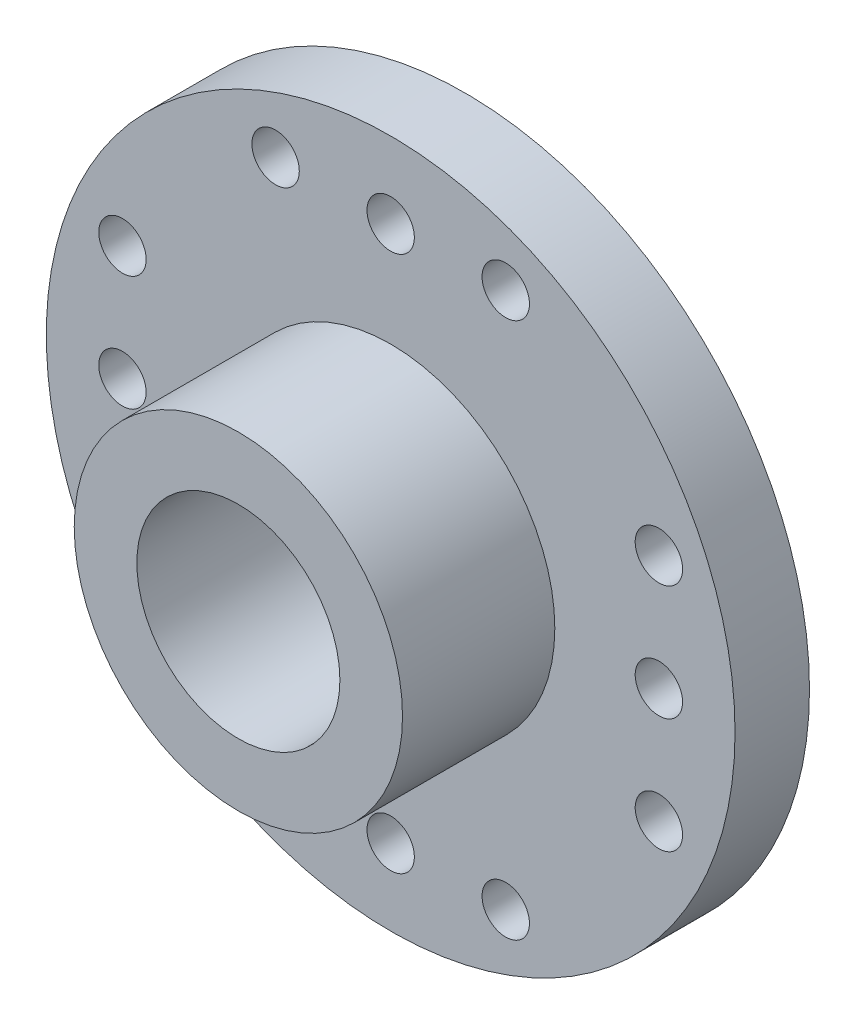
ISO-10303-21;
HEADER;
FILE_DESCRIPTION(('STEP AP214'),'2;1');
FILE_NAME('part.step','',(''),(''),'','','');
FILE_SCHEMA(('AUTOMOTIVE_DESIGN { 1 0 10303 214 1 1 1 1 }'));
ENDSEC;
DATA;
#1=APPLICATION_CONTEXT('core data for automotive mechanical design processes');
#2=APPLICATION_PROTOCOL_DEFINITION('international standard','automotive_design',2000,#1);
#3=PRODUCT_CONTEXT('',#1,'mechanical');
#4=PRODUCT('Part','Part','',(#3));
#5=PRODUCT_RELATED_PRODUCT_CATEGORY('part','',(#4));
#6=PRODUCT_DEFINITION_FORMATION('','',#4);
#7=PRODUCT_DEFINITION_CONTEXT('part definition',#1,'design');
#8=PRODUCT_DEFINITION('design','',#6,#7);
#9=PRODUCT_DEFINITION_SHAPE('','',#8);
#10=(LENGTH_UNIT() NAMED_UNIT(*) SI_UNIT(.MILLI.,.METRE.));
#11=(NAMED_UNIT(*) PLANE_ANGLE_UNIT() SI_UNIT($,.RADIAN.));
#12=(NAMED_UNIT(*) SI_UNIT($,.STERADIAN.) SOLID_ANGLE_UNIT());
#13=UNCERTAINTY_MEASURE_WITH_UNIT(LENGTH_MEASURE(1.E-05),#10,'distance_accuracy_value','');
#14=(GEOMETRIC_REPRESENTATION_CONTEXT(3) GLOBAL_UNCERTAINTY_ASSIGNED_CONTEXT((#13)) GLOBAL_UNIT_ASSIGNED_CONTEXT((#10,
#11,#12)) REPRESENTATION_CONTEXT('',''));
#15=CARTESIAN_POINT('',(0.,0.,0.));
#16=DIRECTION('',(0.,0.,1.));
#17=DIRECTION('',(1.,0.,0.));
#18=AXIS2_PLACEMENT_3D('',#15,#16,#17);
#19=CARTESIAN_POINT('',(0.,0.,2.2));
#20=DIRECTION('',(0.,0.,1.));
#21=DIRECTION('',(1.,0.,0.));
#22=AXIS2_PLACEMENT_3D('',#19,#20,#21);
#23=PLANE('',#22);
#24=CARTESIAN_POINT('',(0.,0.,2.2));
#25=DIRECTION('',(0.,0.,1.));
#26=DIRECTION('',(1.,0.,0.));
#27=AXIS2_PLACEMENT_3D('',#24,#25,#26);
#28=CIRCLE('',#27,1.375);
#29=CARTESIAN_POINT('',(1.375,0.,2.2));
#30=VERTEX_POINT('',#29);
#31=EDGE_CURVE('E180',#30,#30,#28,.T.);
#32=ORIENTED_EDGE('',*,*,#31,.F.);
#33=EDGE_LOOP('',(#32));
#34=FACE_BOUND('',#33,.T.);
#35=CARTESIAN_POINT('',(0.,0.,2.2));
#36=DIRECTION('',(0.,0.,1.));
#37=DIRECTION('',(1.,0.,0.));
#38=AXIS2_PLACEMENT_3D('',#35,#36,#37);
#39=CIRCLE('',#38,3.);
#40=CARTESIAN_POINT('',(3.,0.,2.2));
#41=VERTEX_POINT('',#40);
#42=EDGE_CURVE('E11',#41,#41,#39,.F.);
#43=ORIENTED_EDGE('',*,*,#42,.F.);
#44=EDGE_LOOP('',(#43));
#45=FACE_BOUND('',#44,.T.);
#46=ADVANCED_FACE('F115',(#34,#45),#23,.T.);
#47=CARTESIAN_POINT('',(0.,0.,2.2));
#48=DIRECTION('',(0.,0.,1.));
#49=DIRECTION('',(1.,0.,0.));
#50=AXIS2_PLACEMENT_3D('',#47,#48,#49);
#51=CIRCLE('',#50,4.85);
#52=CARTESIAN_POINT('',(4.85,0.,2.2));
#53=VERTEX_POINT('',#52);
#54=EDGE_CURVE('E240',#53,#53,#51,.T.);
#55=ORIENTED_EDGE('',*,*,#54,.F.);
#56=EDGE_LOOP('',(#55));
#57=FACE_BOUND('',#56,.T.);
#58=CARTESIAN_POINT('',(-3.4,-7.925,2.2));
#59=DIRECTION('',(0.,0.,1.));
#60=DIRECTION('',(1.,0.,0.));
#61=AXIS2_PLACEMENT_3D('',#58,#59,#60);
#62=CIRCLE('',#61,0.7);
#63=CARTESIAN_POINT('',(-2.7,-7.925,2.2));
#64=VERTEX_POINT('',#63);
#65=EDGE_CURVE('E220',#64,#64,#62,.T.);
#66=ORIENTED_EDGE('',*,*,#65,.F.);
#67=EDGE_LOOP('',(#66));
#68=FACE_BOUND('',#67,.T.);
#69=CARTESIAN_POINT('',(0.,7.925,2.2));
#70=DIRECTION('',(0.,0.,1.));
#71=DIRECTION('',(1.,0.,0.));
#72=AXIS2_PLACEMENT_3D('',#69,#70,#71);
#73=CIRCLE('',#72,0.7);
#74=CARTESIAN_POINT('',(0.7,7.925,2.2));
#75=VERTEX_POINT('',#74);
#76=EDGE_CURVE('E204',#75,#75,#73,.T.);
#77=ORIENTED_EDGE('',*,*,#76,.F.);
#78=EDGE_LOOP('',(#77));
#79=FACE_BOUND('',#78,.T.);
#80=CARTESIAN_POINT('',(-3.4,7.925,2.2));
#81=DIRECTION('',(0.,0.,1.));
#82=DIRECTION('',(1.,0.,0.));
#83=AXIS2_PLACEMENT_3D('',#80,#81,#82);
#84=CIRCLE('',#83,0.7);
#85=CARTESIAN_POINT('',(-2.7,7.925,2.2));
#86=VERTEX_POINT('',#85);
#87=EDGE_CURVE('E188',#86,#86,#84,.T.);
#88=ORIENTED_EDGE('',*,*,#87,.F.);
#89=EDGE_LOOP('',(#88));
#90=FACE_BOUND('',#89,.T.);
#91=CARTESIAN_POINT('',(7.925,0.,2.2));
#92=DIRECTION('',(0.,0.,1.));
#93=DIRECTION('',(1.,0.,0.));
#94=AXIS2_PLACEMENT_3D('',#91,#92,#93);
#95=CIRCLE('',#94,0.7);
#96=CARTESIAN_POINT('',(8.625,0.,2.2));
#97=VERTEX_POINT('',#96);
#98=EDGE_CURVE('E172',#97,#97,#95,.T.);
#99=ORIENTED_EDGE('',*,*,#98,.F.);
#100=EDGE_LOOP('',(#99));
#101=FACE_BOUND('',#100,.T.);
#102=CARTESIAN_POINT('',(7.925,-3.4,2.2));
#103=DIRECTION('',(0.,0.,1.));
#104=DIRECTION('',(1.,0.,0.));
#105=AXIS2_PLACEMENT_3D('',#102,#103,#104);
#106=CIRCLE('',#105,0.7);
#107=CARTESIAN_POINT('',(8.625,-3.4,2.2));
#108=VERTEX_POINT('',#107);
#109=EDGE_CURVE('E156',#108,#108,#106,.T.);
#110=ORIENTED_EDGE('',*,*,#109,.F.);
#111=EDGE_LOOP('',(#110));
#112=FACE_BOUND('',#111,.T.);
#113=CARTESIAN_POINT('',(-7.925,3.4,2.2));
#114=DIRECTION('',(0.,0.,1.));
#115=DIRECTION('',(1.,0.,0.));
#116=AXIS2_PLACEMENT_3D('',#113,#114,#115);
#117=CIRCLE('',#116,0.7);
#118=CARTESIAN_POINT('',(-7.225,3.4,2.2));
#119=VERTEX_POINT('',#118);
#120=EDGE_CURVE('E140',#119,#119,#117,.T.);
#121=ORIENTED_EDGE('',*,*,#120,.F.);
#122=EDGE_LOOP('',(#121));
#123=FACE_BOUND('',#122,.T.);
#124=CARTESIAN_POINT('',(0.,0.,2.2));
#125=DIRECTION('',(0.,0.,1.));
#126=DIRECTION('',(1.,0.,0.));
#127=AXIS2_PLACEMENT_3D('',#124,#125,#126);
#128=CIRCLE('',#127,10.175);
#129=CARTESIAN_POINT('',(10.175,0.,2.2));
#130=VERTEX_POINT('',#129);
#131=EDGE_CURVE('E123',#130,#130,#128,.T.);
#132=ORIENTED_EDGE('',*,*,#131,.T.);
#133=EDGE_LOOP('',(#132));
#134=FACE_BOUND('',#133,.T.);
#135=CARTESIAN_POINT('',(-7.925,-3.4,2.2));
#136=DIRECTION('',(0.,0.,1.));
#137=DIRECTION('',(1.,0.,0.));
#138=AXIS2_PLACEMENT_3D('',#135,#136,#137);
#139=CIRCLE('',#138,0.7);
#140=CARTESIAN_POINT('',(-7.225,-3.4,2.2));
#141=VERTEX_POINT('',#140);
#142=EDGE_CURVE('E134',#141,#141,#139,.T.);
#143=ORIENTED_EDGE('',*,*,#142,.F.);
#144=EDGE_LOOP('',(#143));
#145=FACE_BOUND('',#144,.T.);
#146=CARTESIAN_POINT('',(-7.925,0.,2.2));
#147=DIRECTION('',(0.,0.,1.));
#148=DIRECTION('',(1.,0.,0.));
#149=AXIS2_PLACEMENT_3D('',#146,#147,#148);
#150=CIRCLE('',#149,0.7);
#151=CARTESIAN_POINT('',(-7.225,0.,2.2));
#152=VERTEX_POINT('',#151);
#153=EDGE_CURVE('E148',#152,#152,#150,.T.);
#154=ORIENTED_EDGE('',*,*,#153,.F.);
#155=EDGE_LOOP('',(#154));
#156=FACE_BOUND('',#155,.T.);
#157=CARTESIAN_POINT('',(7.925,3.4,2.2));
#158=DIRECTION('',(0.,0.,1.));
#159=DIRECTION('',(1.,0.,0.));
#160=AXIS2_PLACEMENT_3D('',#157,#158,#159);
#161=CIRCLE('',#160,0.7);
#162=CARTESIAN_POINT('',(8.625,3.4,2.2));
#163=VERTEX_POINT('',#162);
#164=EDGE_CURVE('E164',#163,#163,#161,.T.);
#165=ORIENTED_EDGE('',*,*,#164,.F.);
#166=EDGE_LOOP('',(#165));
#167=FACE_BOUND('',#166,.T.);
#168=CARTESIAN_POINT('',(3.4,7.925,2.2));
#169=DIRECTION('',(0.,0.,1.));
#170=DIRECTION('',(1.,0.,0.));
#171=AXIS2_PLACEMENT_3D('',#168,#169,#170);
#172=CIRCLE('',#171,0.7);
#173=CARTESIAN_POINT('',(4.1,7.925,2.2));
#174=VERTEX_POINT('',#173);
#175=EDGE_CURVE('E196',#174,#174,#172,.T.);
#176=ORIENTED_EDGE('',*,*,#175,.F.);
#177=EDGE_LOOP('',(#176));
#178=FACE_BOUND('',#177,.T.);
#179=CARTESIAN_POINT('',(3.4,-7.925,2.2));
#180=DIRECTION('',(0.,0.,1.));
#181=DIRECTION('',(1.,0.,0.));
#182=AXIS2_PLACEMENT_3D('',#179,#180,#181);
#183=CIRCLE('',#182,0.7);
#184=CARTESIAN_POINT('',(4.1,-7.925,2.2));
#185=VERTEX_POINT('',#184);
#186=EDGE_CURVE('E212',#185,#185,#183,.T.);
#187=ORIENTED_EDGE('',*,*,#186,.F.);
#188=EDGE_LOOP('',(#187));
#189=FACE_BOUND('',#188,.T.);
#190=CARTESIAN_POINT('',(0.,-7.925,2.2));
#191=DIRECTION('',(0.,0.,1.));
#192=DIRECTION('',(1.,0.,0.));
#193=AXIS2_PLACEMENT_3D('',#190,#191,#192);
#194=CIRCLE('',#193,0.7);
#195=CARTESIAN_POINT('',(0.7,-7.925,2.2));
#196=VERTEX_POINT('',#195);
#197=EDGE_CURVE('E228',#196,#196,#194,.T.);
#198=ORIENTED_EDGE('',*,*,#197,.F.);
#199=EDGE_LOOP('',(#198));
#200=FACE_BOUND('',#199,.T.);
#201=ADVANCED_FACE('F271',(#57,#68,#79,#90,#101,#112,#123,#134,#145,#156,#167,#178,#189,#200),
#23,.T.);
#202=CARTESIAN_POINT('',(0.,0.,0.));
#203=DIRECTION('',(0.,0.,1.));
#204=DIRECTION('',(1.,0.,0.));
#205=AXIS2_PLACEMENT_3D('',#202,#203,#204);
#206=PLANE('',#205);
#207=CARTESIAN_POINT('',(0.,0.,0.));
#208=DIRECTION('',(0.,0.,1.));
#209=DIRECTION('',(1.,0.,0.));
#210=AXIS2_PLACEMENT_3D('',#207,#208,#209);
#211=CIRCLE('',#210,10.175);
#212=CARTESIAN_POINT('',(10.175,0.,0.));
#213=VERTEX_POINT('',#212);
#214=EDGE_CURVE('E128',#213,#213,#211,.T.);
#215=ORIENTED_EDGE('',*,*,#214,.F.);
#216=EDGE_LOOP('',(#215));
#217=FACE_BOUND('',#216,.T.);
#218=CARTESIAN_POINT('',(-7.925,-3.4,0.));
#219=DIRECTION('',(0.,0.,1.));
#220=DIRECTION('',(1.,0.,0.));
#221=AXIS2_PLACEMENT_3D('',#218,#219,#220);
#222=CIRCLE('',#221,0.7);
#223=CARTESIAN_POINT('',(-7.225,-3.4,0.));
#224=VERTEX_POINT('',#223);
#225=EDGE_CURVE('E136',#224,#224,#222,.T.);
#226=ORIENTED_EDGE('',*,*,#225,.T.);
#227=EDGE_LOOP('',(#226));
#228=FACE_BOUND('',#227,.T.);
#229=CARTESIAN_POINT('',(-7.925,3.4,0.));
#230=DIRECTION('',(0.,0.,1.));
#231=DIRECTION('',(1.,0.,0.));
#232=AXIS2_PLACEMENT_3D('',#229,#230,#231);
#233=CIRCLE('',#232,0.7);
#234=CARTESIAN_POINT('',(-7.225,3.4,0.));
#235=VERTEX_POINT('',#234);
#236=EDGE_CURVE('E144',#235,#235,#233,.T.);
#237=ORIENTED_EDGE('',*,*,#236,.T.);
#238=EDGE_LOOP('',(#237));
#239=FACE_BOUND('',#238,.T.);
#240=CARTESIAN_POINT('',(-7.925,0.,0.));
#241=DIRECTION('',(0.,0.,1.));
#242=DIRECTION('',(1.,0.,0.));
#243=AXIS2_PLACEMENT_3D('',#240,#241,#242);
#244=CIRCLE('',#243,0.7);
#245=CARTESIAN_POINT('',(-7.225,0.,0.));
#246=VERTEX_POINT('',#245);
#247=EDGE_CURVE('E152',#246,#246,#244,.T.);
#248=ORIENTED_EDGE('',*,*,#247,.T.);
#249=EDGE_LOOP('',(#248));
#250=FACE_BOUND('',#249,.T.);
#251=CARTESIAN_POINT('',(7.925,-3.4,0.));
#252=DIRECTION('',(0.,0.,1.));
#253=DIRECTION('',(1.,0.,0.));
#254=AXIS2_PLACEMENT_3D('',#251,#252,#253);
#255=CIRCLE('',#254,0.7);
#256=CARTESIAN_POINT('',(8.625,-3.4,0.));
#257=VERTEX_POINT('',#256);
#258=EDGE_CURVE('E160',#257,#257,#255,.T.);
#259=ORIENTED_EDGE('',*,*,#258,.T.);
#260=EDGE_LOOP('',(#259));
#261=FACE_BOUND('',#260,.T.);
#262=CARTESIAN_POINT('',(7.925,3.4,0.));
#263=DIRECTION('',(0.,0.,1.));
#264=DIRECTION('',(1.,0.,0.));
#265=AXIS2_PLACEMENT_3D('',#262,#263,#264);
#266=CIRCLE('',#265,0.7);
#267=CARTESIAN_POINT('',(8.625,3.4,0.));
#268=VERTEX_POINT('',#267);
#269=EDGE_CURVE('E168',#268,#268,#266,.T.);
#270=ORIENTED_EDGE('',*,*,#269,.T.);
#271=EDGE_LOOP('',(#270));
#272=FACE_BOUND('',#271,.T.);
#273=CARTESIAN_POINT('',(7.925,0.,0.));
#274=DIRECTION('',(0.,0.,1.));
#275=DIRECTION('',(1.,0.,0.));
#276=AXIS2_PLACEMENT_3D('',#273,#274,#275);
#277=CIRCLE('',#276,0.7);
#278=CARTESIAN_POINT('',(8.625,0.,0.));
#279=VERTEX_POINT('',#278);
#280=EDGE_CURVE('E176',#279,#279,#277,.T.);
#281=ORIENTED_EDGE('',*,*,#280,.T.);
#282=EDGE_LOOP('',(#281));
#283=FACE_BOUND('',#282,.T.);
#284=CARTESIAN_POINT('',(0.,0.,0.));
#285=DIRECTION('',(0.,0.,1.));
#286=DIRECTION('',(1.,0.,0.));
#287=AXIS2_PLACEMENT_3D('',#284,#285,#286);
#288=CIRCLE('',#287,1.375);
#289=CARTESIAN_POINT('',(1.375,0.,0.));
#290=VERTEX_POINT('',#289);
#291=EDGE_CURVE('E184',#290,#290,#288,.T.);
#292=ORIENTED_EDGE('',*,*,#291,.T.);
#293=EDGE_LOOP('',(#292));
#294=FACE_BOUND('',#293,.T.);
#295=CARTESIAN_POINT('',(-3.4,7.925,0.));
#296=DIRECTION('',(0.,0.,1.));
#297=DIRECTION('',(1.,0.,0.));
#298=AXIS2_PLACEMENT_3D('',#295,#296,#297);
#299=CIRCLE('',#298,0.7);
#300=CARTESIAN_POINT('',(-2.7,7.925,0.));
#301=VERTEX_POINT('',#300);
#302=EDGE_CURVE('E192',#301,#301,#299,.T.);
#303=ORIENTED_EDGE('',*,*,#302,.T.);
#304=EDGE_LOOP('',(#303));
#305=FACE_BOUND('',#304,.T.);
#306=CARTESIAN_POINT('',(3.4,7.925,0.));
#307=DIRECTION('',(0.,0.,1.));
#308=DIRECTION('',(1.,0.,0.));
#309=AXIS2_PLACEMENT_3D('',#306,#307,#308);
#310=CIRCLE('',#309,0.7);
#311=CARTESIAN_POINT('',(4.1,7.925,0.));
#312=VERTEX_POINT('',#311);
#313=EDGE_CURVE('E200',#312,#312,#310,.T.);
#314=ORIENTED_EDGE('',*,*,#313,.T.);
#315=EDGE_LOOP('',(#314));
#316=FACE_BOUND('',#315,.T.);
#317=CARTESIAN_POINT('',(0.,7.925,0.));
#318=DIRECTION('',(0.,0.,1.));
#319=DIRECTION('',(1.,0.,0.));
#320=AXIS2_PLACEMENT_3D('',#317,#318,#319);
#321=CIRCLE('',#320,0.7);
#322=CARTESIAN_POINT('',(0.7,7.925,0.));
#323=VERTEX_POINT('',#322);
#324=EDGE_CURVE('E208',#323,#323,#321,.T.);
#325=ORIENTED_EDGE('',*,*,#324,.T.);
#326=EDGE_LOOP('',(#325));
#327=FACE_BOUND('',#326,.T.);
#328=CARTESIAN_POINT('',(3.4,-7.925,0.));
#329=DIRECTION('',(0.,0.,1.));
#330=DIRECTION('',(1.,0.,0.));
#331=AXIS2_PLACEMENT_3D('',#328,#329,#330);
#332=CIRCLE('',#331,0.7);
#333=CARTESIAN_POINT('',(4.1,-7.925,0.));
#334=VERTEX_POINT('',#333);
#335=EDGE_CURVE('E216',#334,#334,#332,.T.);
#336=ORIENTED_EDGE('',*,*,#335,.T.);
#337=EDGE_LOOP('',(#336));
#338=FACE_BOUND('',#337,.T.);
#339=CARTESIAN_POINT('',(-3.4,-7.925,0.));
#340=DIRECTION('',(0.,0.,1.));
#341=DIRECTION('',(1.,0.,0.));
#342=AXIS2_PLACEMENT_3D('',#339,#340,#341);
#343=CIRCLE('',#342,0.7);
#344=CARTESIAN_POINT('',(-2.7,-7.925,0.));
#345=VERTEX_POINT('',#344);
#346=EDGE_CURVE('E224',#345,#345,#343,.T.);
#347=ORIENTED_EDGE('',*,*,#346,.T.);
#348=EDGE_LOOP('',(#347));
#349=FACE_BOUND('',#348,.T.);
#350=CARTESIAN_POINT('',(0.,-7.925,0.));
#351=DIRECTION('',(0.,0.,1.));
#352=DIRECTION('',(1.,0.,0.));
#353=AXIS2_PLACEMENT_3D('',#350,#351,#352);
#354=CIRCLE('',#353,0.7);
#355=CARTESIAN_POINT('',(0.7,-7.925,0.));
#356=VERTEX_POINT('',#355);
#357=EDGE_CURVE('E232',#356,#356,#354,.T.);
#358=ORIENTED_EDGE('',*,*,#357,.T.);
#359=EDGE_LOOP('',(#358));
#360=FACE_BOUND('',#359,.T.);
#361=ADVANCED_FACE('F277',(#217,#228,#239,#250,#261,#272,#283,#294,#305,#316,#327,#338,#349,
#360),#206,.F.);
#362=CARTESIAN_POINT('',(0.,0.,2.2));
#363=DIRECTION('',(0.,0.,-1.));
#364=DIRECTION('',(-1.,0.,0.));
#365=AXIS2_PLACEMENT_3D('',#362,#363,#364);
#366=CYLINDRICAL_SURFACE('',#365,10.175);
#367=ORIENTED_EDGE('',*,*,#131,.F.);
#368=EDGE_LOOP('',(#367));
#369=FACE_BOUND('',#368,.T.);
#370=ORIENTED_EDGE('',*,*,#214,.T.);
#371=EDGE_LOOP('',(#370));
#372=FACE_BOUND('',#371,.T.);
#373=ADVANCED_FACE('F117',(#369,#372),#366,.T.);
#374=CARTESIAN_POINT('',(-7.925,-3.4,2.2));
#375=DIRECTION('',(0.,0.,-1.));
#376=DIRECTION('',(-1.,0.,0.));
#377=AXIS2_PLACEMENT_3D('',#374,#375,#376);
#378=CYLINDRICAL_SURFACE('',#377,0.7);
#379=ORIENTED_EDGE('',*,*,#142,.T.);
#380=EDGE_LOOP('',(#379));
#381=FACE_BOUND('',#380,.T.);
#382=ORIENTED_EDGE('',*,*,#225,.F.);
#383=EDGE_LOOP('',(#382));
#384=FACE_BOUND('',#383,.T.);
#385=ADVANCED_FACE('F282',(#381,#384),#378,.F.);
#386=CARTESIAN_POINT('',(-7.925,3.4,2.2));
#387=DIRECTION('',(0.,0.,-1.));
#388=DIRECTION('',(-1.,0.,0.));
#389=AXIS2_PLACEMENT_3D('',#386,#387,#388);
#390=CYLINDRICAL_SURFACE('',#389,0.7);
#391=ORIENTED_EDGE('',*,*,#120,.T.);
#392=EDGE_LOOP('',(#391));
#393=FACE_BOUND('',#392,.T.);
#394=ORIENTED_EDGE('',*,*,#236,.F.);
#395=EDGE_LOOP('',(#394));
#396=FACE_BOUND('',#395,.T.);
#397=ADVANCED_FACE('F359',(#393,#396),#390,.F.);
#398=CARTESIAN_POINT('',(-7.925,0.,2.2));
#399=DIRECTION('',(0.,0.,-1.));
#400=DIRECTION('',(-1.,0.,0.));
#401=AXIS2_PLACEMENT_3D('',#398,#399,#400);
#402=CYLINDRICAL_SURFACE('',#401,0.7);
#403=ORIENTED_EDGE('',*,*,#153,.T.);
#404=EDGE_LOOP('',(#403));
#405=FACE_BOUND('',#404,.T.);
#406=ORIENTED_EDGE('',*,*,#247,.F.);
#407=EDGE_LOOP('',(#406));
#408=FACE_BOUND('',#407,.T.);
#409=ADVANCED_FACE('F356',(#405,#408),#402,.F.);
#410=CARTESIAN_POINT('',(7.925,-3.4,2.2));
#411=DIRECTION('',(0.,0.,-1.));
#412=DIRECTION('',(-1.,0.,0.));
#413=AXIS2_PLACEMENT_3D('',#410,#411,#412);
#414=CYLINDRICAL_SURFACE('',#413,0.7);
#415=ORIENTED_EDGE('',*,*,#109,.T.);
#416=EDGE_LOOP('',(#415));
#417=FACE_BOUND('',#416,.T.);
#418=ORIENTED_EDGE('',*,*,#258,.F.);
#419=EDGE_LOOP('',(#418));
#420=FACE_BOUND('',#419,.T.);
#421=ADVANCED_FACE('F352',(#417,#420),#414,.F.);
#422=CARTESIAN_POINT('',(7.925,3.4,2.2));
#423=DIRECTION('',(0.,0.,-1.));
#424=DIRECTION('',(-1.,0.,0.));
#425=AXIS2_PLACEMENT_3D('',#422,#423,#424);
#426=CYLINDRICAL_SURFACE('',#425,0.7);
#427=ORIENTED_EDGE('',*,*,#164,.T.);
#428=EDGE_LOOP('',(#427));
#429=FACE_BOUND('',#428,.T.);
#430=ORIENTED_EDGE('',*,*,#269,.F.);
#431=EDGE_LOOP('',(#430));
#432=FACE_BOUND('',#431,.T.);
#433=ADVANCED_FACE('F348',(#429,#432),#426,.F.);
#434=CARTESIAN_POINT('',(7.925,0.,2.2));
#435=DIRECTION('',(0.,0.,-1.));
#436=DIRECTION('',(-1.,0.,0.));
#437=AXIS2_PLACEMENT_3D('',#434,#435,#436);
#438=CYLINDRICAL_SURFACE('',#437,0.7);
#439=ORIENTED_EDGE('',*,*,#98,.T.);
#440=EDGE_LOOP('',(#439));
#441=FACE_BOUND('',#440,.T.);
#442=ORIENTED_EDGE('',*,*,#280,.F.);
#443=EDGE_LOOP('',(#442));
#444=FACE_BOUND('',#443,.T.);
#445=ADVANCED_FACE('F344',(#441,#444),#438,.F.);
#446=CARTESIAN_POINT('',(0.,0.,2.2));
#447=DIRECTION('',(0.,0.,-1.));
#448=DIRECTION('',(-1.,0.,0.));
#449=AXIS2_PLACEMENT_3D('',#446,#447,#448);
#450=CYLINDRICAL_SURFACE('',#449,1.375);
#451=ORIENTED_EDGE('',*,*,#31,.T.);
#452=EDGE_LOOP('',(#451));
#453=FACE_BOUND('',#452,.T.);
#454=ORIENTED_EDGE('',*,*,#291,.F.);
#455=EDGE_LOOP('',(#454));
#456=FACE_BOUND('',#455,.T.);
#457=ADVANCED_FACE('F340',(#453,#456),#450,.F.);
#458=CARTESIAN_POINT('',(-3.4,7.925,2.2));
#459=DIRECTION('',(0.,0.,-1.));
#460=DIRECTION('',(-1.,0.,0.));
#461=AXIS2_PLACEMENT_3D('',#458,#459,#460);
#462=CYLINDRICAL_SURFACE('',#461,0.7);
#463=ORIENTED_EDGE('',*,*,#87,.T.);
#464=EDGE_LOOP('',(#463));
#465=FACE_BOUND('',#464,.T.);
#466=ORIENTED_EDGE('',*,*,#302,.F.);
#467=EDGE_LOOP('',(#466));
#468=FACE_BOUND('',#467,.T.);
#469=ADVANCED_FACE('F336',(#465,#468),#462,.F.);
#470=CARTESIAN_POINT('',(3.4,7.925,2.2));
#471=DIRECTION('',(0.,0.,-1.));
#472=DIRECTION('',(-1.,0.,0.));
#473=AXIS2_PLACEMENT_3D('',#470,#471,#472);
#474=CYLINDRICAL_SURFACE('',#473,0.7);
#475=ORIENTED_EDGE('',*,*,#175,.T.);
#476=EDGE_LOOP('',(#475));
#477=FACE_BOUND('',#476,.T.);
#478=ORIENTED_EDGE('',*,*,#313,.F.);
#479=EDGE_LOOP('',(#478));
#480=FACE_BOUND('',#479,.T.);
#481=ADVANCED_FACE('F332',(#477,#480),#474,.F.);
#482=CARTESIAN_POINT('',(0.,7.925,2.2));
#483=DIRECTION('',(0.,0.,-1.));
#484=DIRECTION('',(-1.,0.,0.));
#485=AXIS2_PLACEMENT_3D('',#482,#483,#484);
#486=CYLINDRICAL_SURFACE('',#485,0.7);
#487=ORIENTED_EDGE('',*,*,#76,.T.);
#488=EDGE_LOOP('',(#487));
#489=FACE_BOUND('',#488,.T.);
#490=ORIENTED_EDGE('',*,*,#324,.F.);
#491=EDGE_LOOP('',(#490));
#492=FACE_BOUND('',#491,.T.);
#493=ADVANCED_FACE('F326',(#489,#492),#486,.F.);
#494=CARTESIAN_POINT('',(3.4,-7.925,2.2));
#495=DIRECTION('',(0.,0.,-1.));
#496=DIRECTION('',(-1.,0.,0.));
#497=AXIS2_PLACEMENT_3D('',#494,#495,#496);
#498=CYLINDRICAL_SURFACE('',#497,0.7);
#499=ORIENTED_EDGE('',*,*,#186,.T.);
#500=EDGE_LOOP('',(#499));
#501=FACE_BOUND('',#500,.T.);
#502=ORIENTED_EDGE('',*,*,#335,.F.);
#503=EDGE_LOOP('',(#502));
#504=FACE_BOUND('',#503,.T.);
#505=ADVANCED_FACE('F320',(#501,#504),#498,.F.);
#506=CARTESIAN_POINT('',(-3.4,-7.925,2.2));
#507=DIRECTION('',(0.,0.,-1.));
#508=DIRECTION('',(-1.,0.,0.));
#509=AXIS2_PLACEMENT_3D('',#506,#507,#508);
#510=CYLINDRICAL_SURFACE('',#509,0.7);
#511=ORIENTED_EDGE('',*,*,#65,.T.);
#512=EDGE_LOOP('',(#511));
#513=FACE_BOUND('',#512,.T.);
#514=ORIENTED_EDGE('',*,*,#346,.F.);
#515=EDGE_LOOP('',(#514));
#516=FACE_BOUND('',#515,.T.);
#517=ADVANCED_FACE('F266',(#513,#516),#510,.F.);
#518=CARTESIAN_POINT('',(0.,-7.925,2.2));
#519=DIRECTION('',(0.,0.,-1.));
#520=DIRECTION('',(-1.,0.,0.));
#521=AXIS2_PLACEMENT_3D('',#518,#519,#520);
#522=CYLINDRICAL_SURFACE('',#521,0.7);
#523=ORIENTED_EDGE('',*,*,#197,.T.);
#524=EDGE_LOOP('',(#523));
#525=FACE_BOUND('',#524,.T.);
#526=ORIENTED_EDGE('',*,*,#357,.F.);
#527=EDGE_LOOP('',(#526));
#528=FACE_BOUND('',#527,.T.);
#529=ADVANCED_FACE('F257',(#525,#528),#522,.F.);
#530=CARTESIAN_POINT('',(0.,0.,6.7));
#531=DIRECTION('',(0.,0.,1.));
#532=DIRECTION('',(1.,0.,0.));
#533=AXIS2_PLACEMENT_3D('',#530,#531,#532);
#534=PLANE('',#533);
#535=CARTESIAN_POINT('',(0.,0.,6.7));
#536=DIRECTION('',(0.,0.,1.));
#537=DIRECTION('',(1.,0.,0.));
#538=AXIS2_PLACEMENT_3D('',#535,#536,#537);
#539=CIRCLE('',#538,4.85);
#540=CARTESIAN_POINT('',(4.85,0.,6.7));
#541=VERTEX_POINT('',#540);
#542=EDGE_CURVE('E236',#541,#541,#539,.T.);
#543=ORIENTED_EDGE('',*,*,#542,.T.);
#544=EDGE_LOOP('',(#543));
#545=FACE_BOUND('',#544,.T.);
#546=CARTESIAN_POINT('',(0.,0.,6.7));
#547=DIRECTION('',(0.,0.,1.));
#548=DIRECTION('',(1.,0.,0.));
#549=AXIS2_PLACEMENT_3D('',#546,#547,#548);
#550=CIRCLE('',#549,3.);
#551=CARTESIAN_POINT('',(3.,0.,6.7));
#552=VERTEX_POINT('',#551);
#553=EDGE_CURVE('E244',#552,#552,#550,.T.);
#554=ORIENTED_EDGE('',*,*,#553,.F.);
#555=EDGE_LOOP('',(#554));
#556=FACE_BOUND('',#555,.T.);
#557=ADVANCED_FACE('F254',(#545,#556),#534,.T.);
#558=CARTESIAN_POINT('',(0.,0.,6.7));
#559=DIRECTION('',(0.,0.,-1.));
#560=DIRECTION('',(-1.,0.,0.));
#561=AXIS2_PLACEMENT_3D('',#558,#559,#560);
#562=CYLINDRICAL_SURFACE('',#561,4.85);
#563=ORIENTED_EDGE('',*,*,#542,.F.);
#564=EDGE_LOOP('',(#563));
#565=FACE_BOUND('',#564,.T.);
#566=ORIENTED_EDGE('',*,*,#54,.T.);
#567=EDGE_LOOP('',(#566));
#568=FACE_BOUND('',#567,.T.);
#569=ADVANCED_FACE('F256',(#565,#568),#562,.T.);
#570=CARTESIAN_POINT('',(0.,0.,6.7));
#571=DIRECTION('',(0.,0.,-1.));
#572=DIRECTION('',(-1.,0.,0.));
#573=AXIS2_PLACEMENT_3D('',#570,#571,#572);
#574=CYLINDRICAL_SURFACE('',#573,3.);
#575=ORIENTED_EDGE('',*,*,#553,.T.);
#576=EDGE_LOOP('',(#575));
#577=FACE_BOUND('',#576,.T.);
#578=ORIENTED_EDGE('',*,*,#42,.T.);
#579=EDGE_LOOP('',(#578));
#580=FACE_BOUND('',#579,.T.);
#581=ADVANCED_FACE('F252',(#577,#580),#574,.F.);
#582=CLOSED_SHELL('',(#46,#201,#361,#373,#385,#397,#409,#421,#433,#445,#457,#469,#481,#493,#505,
#517,#529,#557,#569,#581));
#583=MANIFOLD_SOLID_BREP('B2',#582);
#584=ADVANCED_BREP_SHAPE_REPRESENTATION('',(#18,#583),#14);
#585=SHAPE_DEFINITION_REPRESENTATION(#9,#584);
ENDSEC;
END-ISO-10303-21;
